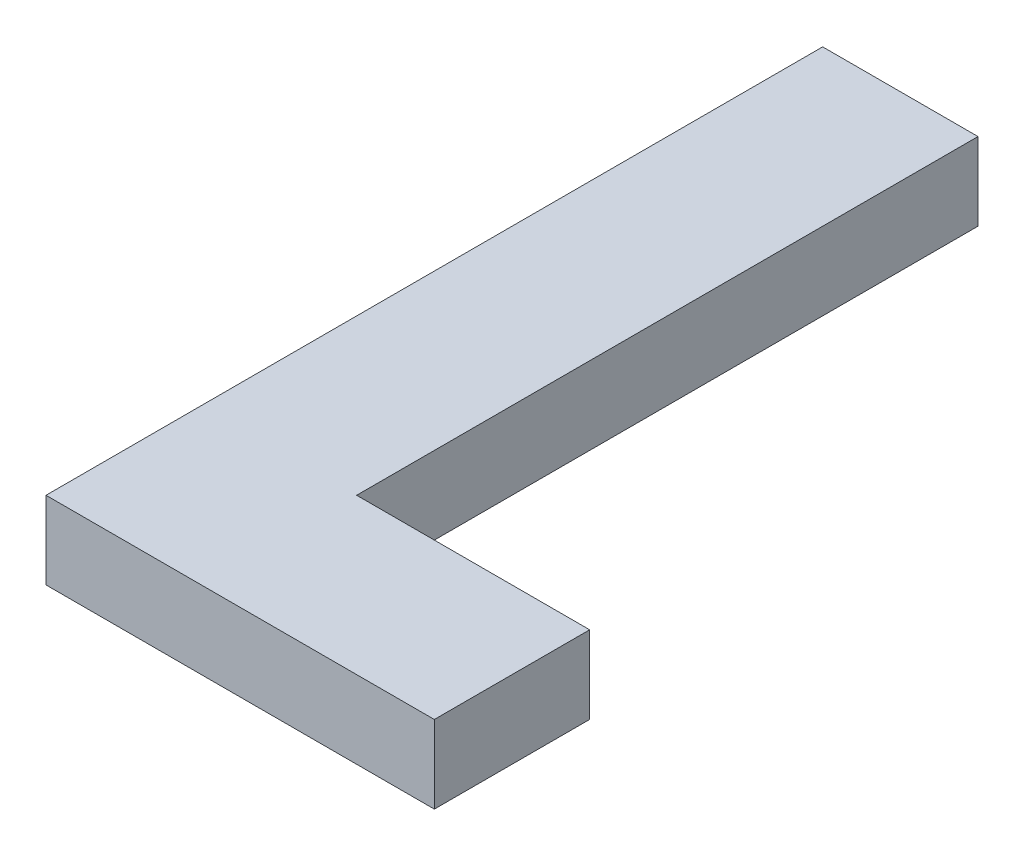
ISO-10303-21;
HEADER;
FILE_DESCRIPTION(('STEP AP214'),'2;1');
FILE_NAME('part.step','',(''),(''),'','','');
FILE_SCHEMA(('AUTOMOTIVE_DESIGN { 1 0 10303 214 1 1 1 1 }'));
ENDSEC;
DATA;
#1=APPLICATION_CONTEXT('core data for automotive mechanical design processes');
#2=APPLICATION_PROTOCOL_DEFINITION('international standard','automotive_design',2000,#1);
#3=PRODUCT_CONTEXT('',#1,'mechanical');
#4=PRODUCT('Part','Part','',(#3));
#5=PRODUCT_RELATED_PRODUCT_CATEGORY('part','',(#4));
#6=PRODUCT_DEFINITION_FORMATION('','',#4);
#7=PRODUCT_DEFINITION_CONTEXT('part definition',#1,'design');
#8=PRODUCT_DEFINITION('design','',#6,#7);
#9=PRODUCT_DEFINITION_SHAPE('','',#8);
#10=(LENGTH_UNIT() NAMED_UNIT(*) SI_UNIT(.MILLI.,.METRE.));
#11=(NAMED_UNIT(*) PLANE_ANGLE_UNIT() SI_UNIT($,.RADIAN.));
#12=(NAMED_UNIT(*) SI_UNIT($,.STERADIAN.) SOLID_ANGLE_UNIT());
#13=UNCERTAINTY_MEASURE_WITH_UNIT(LENGTH_MEASURE(1.E-05),#10,'distance_accuracy_value','');
#14=(GEOMETRIC_REPRESENTATION_CONTEXT(3) GLOBAL_UNCERTAINTY_ASSIGNED_CONTEXT((#13)) GLOBAL_UNIT_ASSIGNED_CONTEXT((#10,
#11,#12)) REPRESENTATION_CONTEXT('',''));
#15=CARTESIAN_POINT('',(0.,0.,0.));
#16=DIRECTION('',(0.,0.,1.));
#17=DIRECTION('',(1.,0.,0.));
#18=AXIS2_PLACEMENT_3D('',#15,#16,#17);
#19=CARTESIAN_POINT('',(10.,10.,-40.));
#20=DIRECTION('',(-1.,0.,0.));
#21=DIRECTION('',(0.,0.,1.));
#22=AXIS2_PLACEMENT_3D('',#19,#20,#21);
#23=PLANE('',#22);
#24=DIRECTION('',(0.,0.,-1.));
#25=VECTOR('',#24,1.);
#26=CARTESIAN_POINT('',(10.,0.,-40.));
#27=LINE('',#26,#25);
#28=CARTESIAN_POINT('',(10.,0.,40.));
#29=VERTEX_POINT('',#28);
#30=CARTESIAN_POINT('',(10.,0.,-40.));
#31=VERTEX_POINT('',#30);
#32=EDGE_CURVE('E90',#29,#31,#27,.T.);
#33=ORIENTED_EDGE('',*,*,#32,.T.);
#34=DIRECTION('',(0.,-1.,0.));
#35=VECTOR('',#34,1.);
#36=CARTESIAN_POINT('',(10.,10.,-40.));
#37=LINE('',#36,#35);
#38=CARTESIAN_POINT('',(10.,10.,-40.));
#39=VERTEX_POINT('',#38);
#40=EDGE_CURVE('E11',#39,#31,#37,.T.);
#41=ORIENTED_EDGE('',*,*,#40,.F.);
#42=DIRECTION('',(0.,0.,-1.));
#43=VECTOR('',#42,1.);
#44=CARTESIAN_POINT('',(10.,10.,-40.));
#45=LINE('',#44,#43);
#46=CARTESIAN_POINT('',(10.,10.,40.));
#47=VERTEX_POINT('',#46);
#48=EDGE_CURVE('E91',#47,#39,#45,.T.);
#49=ORIENTED_EDGE('',*,*,#48,.F.);
#50=DIRECTION('',(0.,-1.,0.));
#51=VECTOR('',#50,1.);
#52=CARTESIAN_POINT('',(10.,10.,40.));
#53=LINE('',#52,#51);
#54=EDGE_CURVE('E74',#47,#29,#53,.T.);
#55=ORIENTED_EDGE('',*,*,#54,.T.);
#56=EDGE_LOOP('',(#33,#41,#49,#55));
#57=FACE_BOUND('',#56,.T.);
#58=ADVANCED_FACE('F36',(#57),#23,.F.);
#59=CARTESIAN_POINT('',(-10.,10.,-40.));
#60=DIRECTION('',(0.,0.,1.));
#61=DIRECTION('',(1.,0.,0.));
#62=AXIS2_PLACEMENT_3D('',#59,#60,#61);
#63=PLANE('',#62);
#64=DIRECTION('',(-1.,0.,0.));
#65=VECTOR('',#64,1.);
#66=CARTESIAN_POINT('',(-10.,0.,-40.));
#67=LINE('',#66,#65);
#68=CARTESIAN_POINT('',(-10.,0.,-40.));
#69=VERTEX_POINT('',#68);
#70=EDGE_CURVE('E63',#31,#69,#67,.T.);
#71=ORIENTED_EDGE('',*,*,#70,.T.);
#72=DIRECTION('',(0.,-1.,0.));
#73=VECTOR('',#72,1.);
#74=CARTESIAN_POINT('',(-10.,10.,-40.));
#75=LINE('',#74,#73);
#76=CARTESIAN_POINT('',(-10.,10.,-40.));
#77=VERTEX_POINT('',#76);
#78=EDGE_CURVE('E44',#77,#69,#75,.T.);
#79=ORIENTED_EDGE('',*,*,#78,.F.);
#80=DIRECTION('',(-1.,0.,0.));
#81=VECTOR('',#80,1.);
#82=CARTESIAN_POINT('',(-10.,10.,-40.));
#83=LINE('',#82,#81);
#84=EDGE_CURVE('E52',#39,#77,#83,.T.);
#85=ORIENTED_EDGE('',*,*,#84,.F.);
#86=ORIENTED_EDGE('',*,*,#40,.T.);
#87=EDGE_LOOP('',(#71,#79,#85,#86));
#88=FACE_BOUND('',#87,.T.);
#89=ADVANCED_FACE('F146',(#88),#63,.F.);
#90=CARTESIAN_POINT('',(-10.,10.,-40.));
#91=DIRECTION('',(1.,0.,0.));
#92=DIRECTION('',(0.,0.,-1.));
#93=AXIS2_PLACEMENT_3D('',#90,#91,#92);
#94=PLANE('',#93);
#95=DIRECTION('',(0.,0.,1.));
#96=VECTOR('',#95,1.);
#97=CARTESIAN_POINT('',(-10.,0.,-40.));
#98=LINE('',#97,#96);
#99=CARTESIAN_POINT('',(-9.99999999999999,0.,60.));
#100=VERTEX_POINT('',#99);
#101=EDGE_CURVE('E97',#69,#100,#98,.T.);
#102=ORIENTED_EDGE('',*,*,#101,.T.);
#103=DIRECTION('',(0.,1.,0.));
#104=VECTOR('',#103,1.);
#105=CARTESIAN_POINT('',(-9.99999999999999,0.,60.));
#106=LINE('',#105,#104);
#107=CARTESIAN_POINT('',(-9.99999999999999,10.,60.));
#108=VERTEX_POINT('',#107);
#109=EDGE_CURVE('E83',#100,#108,#106,.T.);
#110=ORIENTED_EDGE('',*,*,#109,.T.);
#111=DIRECTION('',(0.,0.,1.));
#112=VECTOR('',#111,1.);
#113=CARTESIAN_POINT('',(-10.,10.,-40.));
#114=LINE('',#113,#112);
#115=EDGE_CURVE('E92',#77,#108,#114,.T.);
#116=ORIENTED_EDGE('',*,*,#115,.F.);
#117=ORIENTED_EDGE('',*,*,#78,.T.);
#118=EDGE_LOOP('',(#102,#110,#116,#117));
#119=FACE_BOUND('',#118,.T.);
#120=ADVANCED_FACE('F107',(#119),#94,.F.);
#121=CARTESIAN_POINT('',(0.,10.,0.));
#122=DIRECTION('',(0.,1.,0.));
#123=DIRECTION('',(0.,0.,1.));
#124=AXIS2_PLACEMENT_3D('',#121,#122,#123);
#125=PLANE('',#124);
#126=ORIENTED_EDGE('',*,*,#48,.T.);
#127=ORIENTED_EDGE('',*,*,#84,.T.);
#128=ORIENTED_EDGE('',*,*,#115,.T.);
#129=DIRECTION('',(1.,0.,0.));
#130=VECTOR('',#129,1.);
#131=CARTESIAN_POINT('',(40.,10.,60.));
#132=LINE('',#131,#130);
#133=CARTESIAN_POINT('',(40.,10.,60.));
#134=VERTEX_POINT('',#133);
#135=EDGE_CURVE('E125',#108,#134,#132,.T.);
#136=ORIENTED_EDGE('',*,*,#135,.T.);
#137=DIRECTION('',(0.,0.,-1.));
#138=VECTOR('',#137,1.);
#139=CARTESIAN_POINT('',(40.,10.,40.));
#140=LINE('',#139,#138);
#141=CARTESIAN_POINT('',(40.,10.,40.));
#142=VERTEX_POINT('',#141);
#143=EDGE_CURVE('E122',#134,#142,#140,.T.);
#144=ORIENTED_EDGE('',*,*,#143,.T.);
#145=DIRECTION('',(-1.,0.,0.));
#146=VECTOR('',#145,1.);
#147=CARTESIAN_POINT('',(-9.99999999999999,10.,40.));
#148=LINE('',#147,#146);
#149=EDGE_CURVE('E119',#142,#47,#148,.T.);
#150=ORIENTED_EDGE('',*,*,#149,.T.);
#151=EDGE_LOOP('',(#126,#127,#128,#136,#144,#150));
#152=FACE_BOUND('',#151,.T.);
#153=ADVANCED_FACE('F133',(#152),#125,.T.);
#154=CARTESIAN_POINT('',(0.,0.,0.));
#155=DIRECTION('',(0.,1.,0.));
#156=DIRECTION('',(0.,0.,1.));
#157=AXIS2_PLACEMENT_3D('',#154,#155,#156);
#158=PLANE('',#157);
#159=ORIENTED_EDGE('',*,*,#32,.F.);
#160=DIRECTION('',(-1.,0.,0.));
#161=VECTOR('',#160,1.);
#162=CARTESIAN_POINT('',(-9.99999999999999,0.,40.));
#163=LINE('',#162,#161);
#164=CARTESIAN_POINT('',(40.,0.,40.));
#165=VERTEX_POINT('',#164);
#166=EDGE_CURVE('E70',#165,#29,#163,.T.);
#167=ORIENTED_EDGE('',*,*,#166,.F.);
#168=DIRECTION('',(0.,0.,-1.));
#169=VECTOR('',#168,1.);
#170=CARTESIAN_POINT('',(40.,0.,40.));
#171=LINE('',#170,#169);
#172=CARTESIAN_POINT('',(40.,0.,60.));
#173=VERTEX_POINT('',#172);
#174=EDGE_CURVE('E84',#173,#165,#171,.T.);
#175=ORIENTED_EDGE('',*,*,#174,.F.);
#176=DIRECTION('',(1.,0.,0.));
#177=VECTOR('',#176,1.);
#178=CARTESIAN_POINT('',(40.,0.,60.));
#179=LINE('',#178,#177);
#180=EDGE_CURVE('E113',#100,#173,#179,.T.);
#181=ORIENTED_EDGE('',*,*,#180,.F.);
#182=ORIENTED_EDGE('',*,*,#101,.F.);
#183=ORIENTED_EDGE('',*,*,#70,.F.);
#184=EDGE_LOOP('',(#159,#167,#175,#181,#182,#183));
#185=FACE_BOUND('',#184,.T.);
#186=ADVANCED_FACE('F94',(#185),#158,.F.);
#187=CARTESIAN_POINT('',(-9.99999999999999,0.,40.));
#188=DIRECTION('',(0.,0.,-1.));
#189=DIRECTION('',(-1.,0.,0.));
#190=AXIS2_PLACEMENT_3D('',#187,#188,#189);
#191=PLANE('',#190);
#192=ORIENTED_EDGE('',*,*,#54,.F.);
#193=ORIENTED_EDGE('',*,*,#149,.F.);
#194=DIRECTION('',(0.,1.,0.));
#195=VECTOR('',#194,1.);
#196=CARTESIAN_POINT('',(40.,0.,40.));
#197=LINE('',#196,#195);
#198=EDGE_CURVE('E78',#165,#142,#197,.T.);
#199=ORIENTED_EDGE('',*,*,#198,.F.);
#200=ORIENTED_EDGE('',*,*,#166,.T.);
#201=EDGE_LOOP('',(#192,#193,#199,#200));
#202=FACE_BOUND('',#201,.T.);
#203=ADVANCED_FACE('F72',(#202),#191,.T.);
#204=CARTESIAN_POINT('',(40.,0.,40.));
#205=DIRECTION('',(1.,0.,0.));
#206=DIRECTION('',(0.,0.,-1.));
#207=AXIS2_PLACEMENT_3D('',#204,#205,#206);
#208=PLANE('',#207);
#209=ORIENTED_EDGE('',*,*,#143,.F.);
#210=DIRECTION('',(0.,1.,0.));
#211=VECTOR('',#210,1.);
#212=CARTESIAN_POINT('',(40.,0.,60.));
#213=LINE('',#212,#211);
#214=EDGE_CURVE('E99',#173,#134,#213,.T.);
#215=ORIENTED_EDGE('',*,*,#214,.F.);
#216=ORIENTED_EDGE('',*,*,#174,.T.);
#217=ORIENTED_EDGE('',*,*,#198,.T.);
#218=EDGE_LOOP('',(#209,#215,#216,#217));
#219=FACE_BOUND('',#218,.T.);
#220=ADVANCED_FACE('F142',(#219),#208,.T.);
#221=CARTESIAN_POINT('',(40.,0.,60.));
#222=DIRECTION('',(0.,0.,1.));
#223=DIRECTION('',(1.,0.,0.));
#224=AXIS2_PLACEMENT_3D('',#221,#222,#223);
#225=PLANE('',#224);
#226=ORIENTED_EDGE('',*,*,#135,.F.);
#227=ORIENTED_EDGE('',*,*,#109,.F.);
#228=ORIENTED_EDGE('',*,*,#180,.T.);
#229=ORIENTED_EDGE('',*,*,#214,.T.);
#230=EDGE_LOOP('',(#226,#227,#228,#229));
#231=FACE_BOUND('',#230,.T.);
#232=ADVANCED_FACE('F137',(#231),#225,.T.);
#233=CLOSED_SHELL('',(#58,#89,#120,#153,#186,#203,#220,#232));
#234=MANIFOLD_SOLID_BREP('B2',#233);
#235=ADVANCED_BREP_SHAPE_REPRESENTATION('',(#18,#234),#14);
#236=SHAPE_DEFINITION_REPRESENTATION(#9,#235);
ENDSEC;
END-ISO-10303-21;
